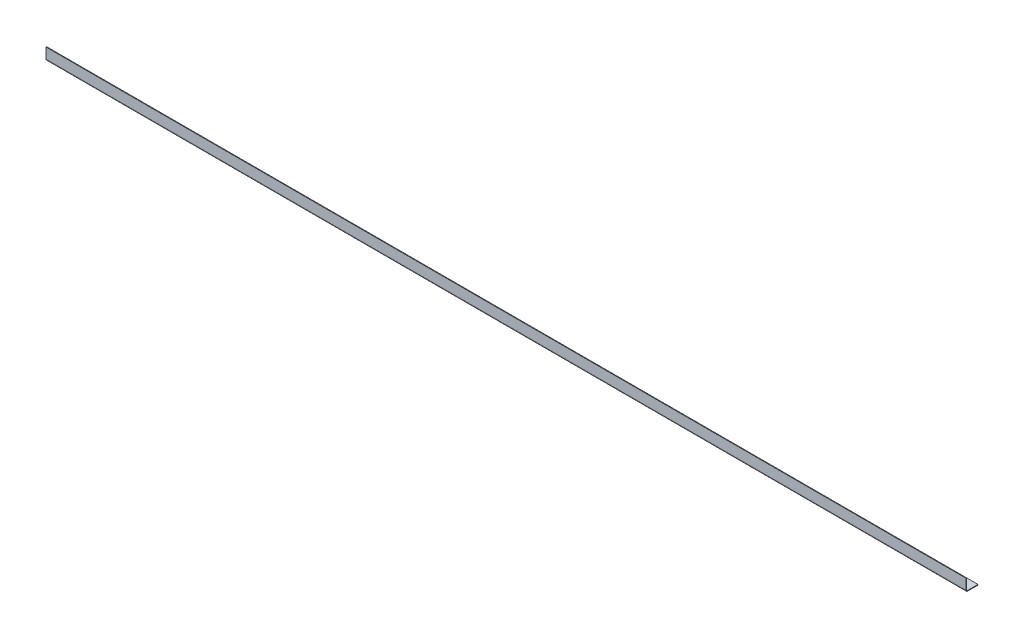
ISO-10303-21;
HEADER;
FILE_DESCRIPTION(('STEP AP214'),'2;1');
FILE_NAME('part.step','',(''),(''),'','','');
FILE_SCHEMA(('AUTOMOTIVE_DESIGN { 1 0 10303 214 1 1 1 1 }'));
ENDSEC;
DATA;
#1=APPLICATION_CONTEXT('core data for automotive mechanical design processes');
#2=APPLICATION_PROTOCOL_DEFINITION('international standard','automotive_design',2000,#1);
#3=PRODUCT_CONTEXT('',#1,'mechanical');
#4=PRODUCT('Part','Part','',(#3));
#5=PRODUCT_RELATED_PRODUCT_CATEGORY('part','',(#4));
#6=PRODUCT_DEFINITION_FORMATION('','',#4);
#7=PRODUCT_DEFINITION_CONTEXT('part definition',#1,'design');
#8=PRODUCT_DEFINITION('design','',#6,#7);
#9=PRODUCT_DEFINITION_SHAPE('','',#8);
#10=(LENGTH_UNIT() NAMED_UNIT(*) SI_UNIT(.MILLI.,.METRE.));
#11=(NAMED_UNIT(*) PLANE_ANGLE_UNIT() SI_UNIT($,.RADIAN.));
#12=(NAMED_UNIT(*) SI_UNIT($,.STERADIAN.) SOLID_ANGLE_UNIT());
#13=UNCERTAINTY_MEASURE_WITH_UNIT(LENGTH_MEASURE(1.E-05),#10,'distance_accuracy_value','');
#14=(GEOMETRIC_REPRESENTATION_CONTEXT(3) GLOBAL_UNCERTAINTY_ASSIGNED_CONTEXT((#13)) GLOBAL_UNIT_ASSIGNED_CONTEXT((#10,
#11,#12)) REPRESENTATION_CONTEXT('',''));
#15=CARTESIAN_POINT('',(0.,0.,0.));
#16=DIRECTION('',(0.,0.,1.));
#17=DIRECTION('',(1.,0.,0.));
#18=AXIS2_PLACEMENT_3D('',#15,#16,#17);
#19=CARTESIAN_POINT('',(1150.,4.,0.));
#20=DIRECTION('',(1.,0.,0.));
#21=DIRECTION('',(0.,0.,-1.));
#22=AXIS2_PLACEMENT_3D('',#19,#20,#21);
#23=PLANE('',#22);
#24=DIRECTION('',(0.,0.,-1.));
#25=VECTOR('',#24,1.);
#26=CARTESIAN_POINT('',(1150.,4.,0.));
#27=LINE('',#26,#25);
#28=CARTESIAN_POINT('',(1150.,4.,0.));
#29=VERTEX_POINT('',#28);
#30=CARTESIAN_POINT('',(1150.,4.,-1.5));
#31=VERTEX_POINT('',#30);
#32=EDGE_CURVE('E11',#29,#31,#27,.T.);
#33=ORIENTED_EDGE('',*,*,#32,.F.);
#34=CARTESIAN_POINT('',(1150.,4.,-4.));
#35=DIRECTION('',(-1.,0.,0.));
#36=DIRECTION('',(0.,0.,1.));
#37=AXIS2_PLACEMENT_3D('',#34,#35,#36);
#38=CIRCLE('',#37,4.);
#39=CARTESIAN_POINT('',(1150.,0.,-4.));
#40=VERTEX_POINT('',#39);
#41=EDGE_CURVE('E124',#29,#40,#38,.F.);
#42=ORIENTED_EDGE('',*,*,#41,.T.);
#43=DIRECTION('',(0.,-1.,0.));
#44=VECTOR('',#43,1.);
#45=CARTESIAN_POINT('',(1150.,1.49999999999995,-4.00000000000003));
#46=LINE('',#45,#44);
#47=CARTESIAN_POINT('',(1150.,1.49999999999995,-4.00000000000003));
#48=VERTEX_POINT('',#47);
#49=EDGE_CURVE('E42',#48,#40,#46,.T.);
#50=ORIENTED_EDGE('',*,*,#49,.F.);
#51=CARTESIAN_POINT('',(1150.,4.,-4.));
#52=DIRECTION('',(1.,0.,0.));
#53=DIRECTION('',(0.,0.,-1.));
#54=AXIS2_PLACEMENT_3D('',#51,#52,#53);
#55=CIRCLE('',#54,2.5);
#56=EDGE_CURVE('E131',#31,#48,#55,.T.);
#57=ORIENTED_EDGE('',*,*,#56,.F.);
#58=EDGE_LOOP('',(#33,#42,#50,#57));
#59=FACE_BOUND('',#58,.T.);
#60=ADVANCED_FACE('F34',(#59),#23,.T.);
#61=CARTESIAN_POINT('',(1150.,1.49999999999995,-4.00000000000003));
#62=DIRECTION('',(1.,0.,0.));
#63=DIRECTION('',(0.,0.,-1.));
#64=AXIS2_PLACEMENT_3D('',#61,#62,#63);
#65=PLANE('',#64);
#66=DIRECTION('',(0.,-1.,0.));
#67=VECTOR('',#66,1.);
#68=CARTESIAN_POINT('',(1150.,30.,0.));
#69=LINE('',#68,#67);
#70=CARTESIAN_POINT('',(1150.,30.,0.));
#71=VERTEX_POINT('',#70);
#72=EDGE_CURVE('E119',#71,#29,#69,.T.);
#73=ORIENTED_EDGE('',*,*,#72,.T.);
#74=ORIENTED_EDGE('',*,*,#32,.T.);
#75=DIRECTION('',(0.,-1.,0.));
#76=VECTOR('',#75,1.);
#77=CARTESIAN_POINT('',(1150.,30.,-1.50000000000003));
#78=LINE('',#77,#76);
#79=CARTESIAN_POINT('',(1150.,30.,-1.50000000000003));
#80=VERTEX_POINT('',#79);
#81=EDGE_CURVE('E129',#80,#31,#78,.T.);
#82=ORIENTED_EDGE('',*,*,#81,.F.);
#83=DIRECTION('',(0.,0.,-1.));
#84=VECTOR('',#83,1.);
#85=CARTESIAN_POINT('',(1150.,30.,0.));
#86=LINE('',#85,#84);
#87=EDGE_CURVE('E110',#71,#80,#86,.T.);
#88=ORIENTED_EDGE('',*,*,#87,.F.);
#89=EDGE_LOOP('',(#73,#74,#82,#88));
#90=FACE_BOUND('',#89,.T.);
#91=ADVANCED_FACE('F127',(#90),#65,.T.);
#92=CARTESIAN_POINT('',(-1150.,0.,-4.));
#93=DIRECTION('',(-1.,0.,0.));
#94=DIRECTION('',(0.,0.,1.));
#95=AXIS2_PLACEMENT_3D('',#92,#93,#94);
#96=PLANE('',#95);
#97=DIRECTION('',(0.,1.,0.));
#98=VECTOR('',#97,1.);
#99=CARTESIAN_POINT('',(-1150.,0.,-4.));
#100=LINE('',#99,#98);
#101=CARTESIAN_POINT('',(-1150.,0.,-4.));
#102=VERTEX_POINT('',#101);
#103=CARTESIAN_POINT('',(-1150.,1.49999999999995,-4.));
#104=VERTEX_POINT('',#103);
#105=EDGE_CURVE('E85',#102,#104,#100,.T.);
#106=ORIENTED_EDGE('',*,*,#105,.F.);
#107=CARTESIAN_POINT('',(-1150.,4.,-4.));
#108=DIRECTION('',(-1.,0.,0.));
#109=DIRECTION('',(0.,0.,1.));
#110=AXIS2_PLACEMENT_3D('',#107,#108,#109);
#111=CIRCLE('',#110,4.);
#112=CARTESIAN_POINT('',(-1150.,4.,0.));
#113=VERTEX_POINT('',#112);
#114=EDGE_CURVE('E153',#113,#102,#111,.F.);
#115=ORIENTED_EDGE('',*,*,#114,.F.);
#116=DIRECTION('',(0.,0.,1.));
#117=VECTOR('',#116,1.);
#118=CARTESIAN_POINT('',(-1150.,4.,-1.5));
#119=LINE('',#118,#117);
#120=CARTESIAN_POINT('',(-1150.,4.,-1.5));
#121=VERTEX_POINT('',#120);
#122=EDGE_CURVE('E78',#121,#113,#119,.T.);
#123=ORIENTED_EDGE('',*,*,#122,.F.);
#124=CARTESIAN_POINT('',(-1150.,4.,-4.));
#125=DIRECTION('',(1.,0.,0.));
#126=DIRECTION('',(0.,0.,-1.));
#127=AXIS2_PLACEMENT_3D('',#124,#125,#126);
#128=CIRCLE('',#127,2.5);
#129=EDGE_CURVE('E146',#121,#104,#128,.T.);
#130=ORIENTED_EDGE('',*,*,#129,.T.);
#131=EDGE_LOOP('',(#106,#115,#123,#130));
#132=FACE_BOUND('',#131,.T.);
#133=ADVANCED_FACE('F185',(#132),#96,.T.);
#134=CARTESIAN_POINT('',(-1150.,4.,-1.5));
#135=DIRECTION('',(-1.,0.,0.));
#136=DIRECTION('',(0.,0.,1.));
#137=AXIS2_PLACEMENT_3D('',#134,#135,#136);
#138=PLANE('',#137);
#139=DIRECTION('',(0.,0.,-1.));
#140=VECTOR('',#139,1.);
#141=CARTESIAN_POINT('',(-1150.,0.,0.));
#142=LINE('',#141,#140);
#143=CARTESIAN_POINT('',(-1150.,0.,-30.));
#144=VERTEX_POINT('',#143);
#145=EDGE_CURVE('E137',#102,#144,#142,.T.);
#146=ORIENTED_EDGE('',*,*,#145,.F.);
#147=ORIENTED_EDGE('',*,*,#105,.T.);
#148=DIRECTION('',(0.,0.,-1.));
#149=VECTOR('',#148,1.);
#150=CARTESIAN_POINT('',(-1150.,1.50000000000006,0.));
#151=LINE('',#150,#149);
#152=CARTESIAN_POINT('',(-1150.,1.50000000000006,-30.));
#153=VERTEX_POINT('',#152);
#154=EDGE_CURVE('E143',#104,#153,#151,.T.);
#155=ORIENTED_EDGE('',*,*,#154,.T.);
#156=DIRECTION('',(0.,-1.,0.));
#157=VECTOR('',#156,1.);
#158=CARTESIAN_POINT('',(-1150.,1.50000000000006,-30.));
#159=LINE('',#158,#157);
#160=EDGE_CURVE('E140',#153,#144,#159,.T.);
#161=ORIENTED_EDGE('',*,*,#160,.T.);
#162=EDGE_LOOP('',(#146,#147,#155,#161));
#163=FACE_BOUND('',#162,.T.);
#164=ADVANCED_FACE('F172',(#163),#138,.T.);
#165=CARTESIAN_POINT('',(1150.,0.,0.));
#166=DIRECTION('',(0.,1.,0.));
#167=DIRECTION('',(0.,0.,1.));
#168=AXIS2_PLACEMENT_3D('',#165,#166,#167);
#169=PLANE('',#168);
#170=ORIENTED_EDGE('',*,*,#145,.T.);
#171=DIRECTION('',(-1.,0.,0.));
#172=VECTOR('',#171,1.);
#173=CARTESIAN_POINT('',(1150.,0.,-30.));
#174=LINE('',#173,#172);
#175=CARTESIAN_POINT('',(1150.,0.,-30.));
#176=VERTEX_POINT('',#175);
#177=EDGE_CURVE('E167',#176,#144,#174,.T.);
#178=ORIENTED_EDGE('',*,*,#177,.F.);
#179=DIRECTION('',(0.,0.,-1.));
#180=VECTOR('',#179,1.);
#181=CARTESIAN_POINT('',(1150.,0.,0.));
#182=LINE('',#181,#180);
#183=EDGE_CURVE('E91',#40,#176,#182,.T.);
#184=ORIENTED_EDGE('',*,*,#183,.F.);
#185=DIRECTION('',(-1.,0.,0.));
#186=VECTOR('',#185,1.);
#187=CARTESIAN_POINT('',(1150.,0.,-4.));
#188=LINE('',#187,#186);
#189=EDGE_CURVE('E136',#40,#102,#188,.T.);
#190=ORIENTED_EDGE('',*,*,#189,.T.);
#191=EDGE_LOOP('',(#170,#178,#184,#190));
#192=FACE_BOUND('',#191,.T.);
#193=ADVANCED_FACE('F221',(#192),#169,.F.);
#194=CARTESIAN_POINT('',(1150.,1.50000000000006,-30.));
#195=DIRECTION('',(0.,0.,-1.));
#196=DIRECTION('',(-1.,0.,0.));
#197=AXIS2_PLACEMENT_3D('',#194,#195,#196);
#198=PLANE('',#197);
#199=ORIENTED_EDGE('',*,*,#160,.F.);
#200=DIRECTION('',(-1.,0.,0.));
#201=VECTOR('',#200,1.);
#202=CARTESIAN_POINT('',(1150.,1.50000000000006,-30.));
#203=LINE('',#202,#201);
#204=CARTESIAN_POINT('',(1150.,1.50000000000006,-30.));
#205=VERTEX_POINT('',#204);
#206=EDGE_CURVE('E165',#205,#153,#203,.T.);
#207=ORIENTED_EDGE('',*,*,#206,.F.);
#208=DIRECTION('',(0.,-1.,0.));
#209=VECTOR('',#208,1.);
#210=CARTESIAN_POINT('',(1150.,1.50000000000006,-30.));
#211=LINE('',#210,#209);
#212=EDGE_CURVE('E191',#205,#176,#211,.T.);
#213=ORIENTED_EDGE('',*,*,#212,.T.);
#214=ORIENTED_EDGE('',*,*,#177,.T.);
#215=EDGE_LOOP('',(#199,#207,#213,#214));
#216=FACE_BOUND('',#215,.T.);
#217=ADVANCED_FACE('F197',(#216),#198,.T.);
#218=CARTESIAN_POINT('',(1150.,1.50000000000006,0.));
#219=DIRECTION('',(0.,1.,0.));
#220=DIRECTION('',(0.,0.,1.));
#221=AXIS2_PLACEMENT_3D('',#218,#219,#220);
#222=PLANE('',#221);
#223=ORIENTED_EDGE('',*,*,#154,.F.);
#224=DIRECTION('',(-1.,0.,0.));
#225=VECTOR('',#224,1.);
#226=CARTESIAN_POINT('',(1150.,1.49999999999995,-4.00000000000003));
#227=LINE('',#226,#225);
#228=EDGE_CURVE('E162',#48,#104,#227,.T.);
#229=ORIENTED_EDGE('',*,*,#228,.F.);
#230=DIRECTION('',(0.,0.,-1.));
#231=VECTOR('',#230,1.);
#232=CARTESIAN_POINT('',(1150.,1.50000000000006,0.));
#233=LINE('',#232,#231);
#234=EDGE_CURVE('E190',#48,#205,#233,.T.);
#235=ORIENTED_EDGE('',*,*,#234,.T.);
#236=ORIENTED_EDGE('',*,*,#206,.T.);
#237=EDGE_LOOP('',(#223,#229,#235,#236));
#238=FACE_BOUND('',#237,.T.);
#239=ADVANCED_FACE('F183',(#238),#222,.T.);
#240=CARTESIAN_POINT('',(1150.,4.,-4.));
#241=DIRECTION('',(-1.,0.,0.));
#242=DIRECTION('',(0.,0.,1.));
#243=AXIS2_PLACEMENT_3D('',#240,#241,#242);
#244=CYLINDRICAL_SURFACE('',#243,2.5);
#245=ORIENTED_EDGE('',*,*,#129,.F.);
#246=DIRECTION('',(-1.,0.,0.));
#247=VECTOR('',#246,1.);
#248=CARTESIAN_POINT('',(1150.,4.,-1.5));
#249=LINE('',#248,#247);
#250=EDGE_CURVE('E159',#31,#121,#249,.T.);
#251=ORIENTED_EDGE('',*,*,#250,.F.);
#252=ORIENTED_EDGE('',*,*,#56,.T.);
#253=ORIENTED_EDGE('',*,*,#228,.T.);
#254=EDGE_LOOP('',(#245,#251,#252,#253));
#255=FACE_BOUND('',#254,.T.);
#256=ADVANCED_FACE('F178',(#255),#244,.F.);
#257=CARTESIAN_POINT('',(1150.,30.,-1.50000000000003));
#258=DIRECTION('',(0.,0.,-1.));
#259=DIRECTION('',(0.,1.,0.));
#260=AXIS2_PLACEMENT_3D('',#257,#258,#259);
#261=PLANE('',#260);
#262=DIRECTION('',(0.,-1.,0.));
#263=VECTOR('',#262,1.);
#264=CARTESIAN_POINT('',(-1150.,30.,-1.5));
#265=LINE('',#264,#263);
#266=CARTESIAN_POINT('',(-1150.,30.,-1.5));
#267=VERTEX_POINT('',#266);
#268=EDGE_CURVE('E148',#267,#121,#265,.T.);
#269=ORIENTED_EDGE('',*,*,#268,.F.);
#270=DIRECTION('',(-1.,0.,0.));
#271=VECTOR('',#270,1.);
#272=CARTESIAN_POINT('',(1150.,30.,-1.50000000000003));
#273=LINE('',#272,#271);
#274=EDGE_CURVE('E114',#80,#267,#273,.T.);
#275=ORIENTED_EDGE('',*,*,#274,.F.);
#276=ORIENTED_EDGE('',*,*,#81,.T.);
#277=ORIENTED_EDGE('',*,*,#250,.T.);
#278=EDGE_LOOP('',(#269,#275,#276,#277));
#279=FACE_BOUND('',#278,.T.);
#280=ADVANCED_FACE('F188',(#279),#261,.T.);
#281=CARTESIAN_POINT('',(1150.,30.,0.));
#282=DIRECTION('',(0.,1.,0.));
#283=DIRECTION('',(0.,0.,1.));
#284=AXIS2_PLACEMENT_3D('',#281,#282,#283);
#285=PLANE('',#284);
#286=DIRECTION('',(0.,0.,-1.));
#287=VECTOR('',#286,1.);
#288=CARTESIAN_POINT('',(-1150.,30.,0.));
#289=LINE('',#288,#287);
#290=CARTESIAN_POINT('',(-1150.,30.,0.));
#291=VERTEX_POINT('',#290);
#292=EDGE_CURVE('E112',#291,#267,#289,.T.);
#293=ORIENTED_EDGE('',*,*,#292,.F.);
#294=DIRECTION('',(-1.,0.,0.));
#295=VECTOR('',#294,1.);
#296=CARTESIAN_POINT('',(1150.,30.,0.));
#297=LINE('',#296,#295);
#298=EDGE_CURVE('E106',#71,#291,#297,.T.);
#299=ORIENTED_EDGE('',*,*,#298,.F.);
#300=ORIENTED_EDGE('',*,*,#87,.T.);
#301=ORIENTED_EDGE('',*,*,#274,.T.);
#302=EDGE_LOOP('',(#293,#299,#300,#301));
#303=FACE_BOUND('',#302,.T.);
#304=ADVANCED_FACE('F108',(#303),#285,.T.);
#305=CARTESIAN_POINT('',(1150.,30.,0.));
#306=DIRECTION('',(0.,0.,-1.));
#307=DIRECTION('',(0.,1.,0.));
#308=AXIS2_PLACEMENT_3D('',#305,#306,#307);
#309=PLANE('',#308);
#310=DIRECTION('',(0.,-1.,0.));
#311=VECTOR('',#310,1.);
#312=CARTESIAN_POINT('',(-1150.,30.,0.));
#313=LINE('',#312,#311);
#314=EDGE_CURVE('E151',#291,#113,#313,.T.);
#315=ORIENTED_EDGE('',*,*,#314,.T.);
#316=DIRECTION('',(-1.,0.,0.));
#317=VECTOR('',#316,1.);
#318=CARTESIAN_POINT('',(1150.,4.,0.));
#319=LINE('',#318,#317);
#320=EDGE_CURVE('E115',#29,#113,#319,.T.);
#321=ORIENTED_EDGE('',*,*,#320,.F.);
#322=ORIENTED_EDGE('',*,*,#72,.F.);
#323=ORIENTED_EDGE('',*,*,#298,.T.);
#324=EDGE_LOOP('',(#315,#321,#322,#323));
#325=FACE_BOUND('',#324,.T.);
#326=ADVANCED_FACE('F120',(#325),#309,.F.);
#327=CARTESIAN_POINT('',(1150.,4.,-4.));
#328=DIRECTION('',(-1.,0.,0.));
#329=DIRECTION('',(0.,0.,1.));
#330=AXIS2_PLACEMENT_3D('',#327,#328,#329);
#331=CYLINDRICAL_SURFACE('',#330,4.);
#332=ORIENTED_EDGE('',*,*,#114,.T.);
#333=ORIENTED_EDGE('',*,*,#189,.F.);
#334=ORIENTED_EDGE('',*,*,#41,.F.);
#335=ORIENTED_EDGE('',*,*,#320,.T.);
#336=EDGE_LOOP('',(#332,#333,#334,#335));
#337=FACE_BOUND('',#336,.T.);
#338=ADVANCED_FACE('F201',(#337),#331,.T.);
#339=CARTESIAN_POINT('',(1150.,4.,-4.));
#340=DIRECTION('',(1.,0.,0.));
#341=DIRECTION('',(0.,0.,-1.));
#342=AXIS2_PLACEMENT_3D('',#339,#340,#341);
#343=PLANE('',#342);
#344=ORIENTED_EDGE('',*,*,#183,.T.);
#345=ORIENTED_EDGE('',*,*,#212,.F.);
#346=ORIENTED_EDGE('',*,*,#234,.F.);
#347=ORIENTED_EDGE('',*,*,#49,.T.);
#348=EDGE_LOOP('',(#344,#345,#346,#347));
#349=FACE_BOUND('',#348,.T.);
#350=ADVANCED_FACE('F198',(#349),#343,.T.);
#351=CARTESIAN_POINT('',(-1150.,4.,-4.));
#352=DIRECTION('',(1.,0.,0.));
#353=DIRECTION('',(0.,0.,-1.));
#354=AXIS2_PLACEMENT_3D('',#351,#352,#353);
#355=PLANE('',#354);
#356=ORIENTED_EDGE('',*,*,#268,.T.);
#357=ORIENTED_EDGE('',*,*,#122,.T.);
#358=ORIENTED_EDGE('',*,*,#314,.F.);
#359=ORIENTED_EDGE('',*,*,#292,.T.);
#360=EDGE_LOOP('',(#356,#357,#358,#359));
#361=FACE_BOUND('',#360,.T.);
#362=ADVANCED_FACE('F200',(#361),#355,.F.);
#363=CLOSED_SHELL('',(#60,#91,#133,#164,#193,#217,#239,#256,#280,#304,#326,#338,#350,#362));
#364=MANIFOLD_SOLID_BREP('B2',#363);
#365=ADVANCED_BREP_SHAPE_REPRESENTATION('',(#18,#364),#14);
#366=SHAPE_DEFINITION_REPRESENTATION(#9,#365);
ENDSEC;
END-ISO-10303-21;
